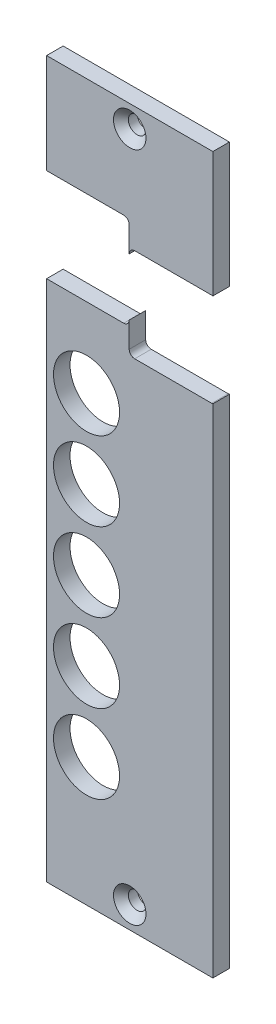
ISO-10303-21;
HEADER;
FILE_DESCRIPTION(('STEP AP214'),'2;1');
FILE_NAME('part.step','',(''),(''),'','','');
FILE_SCHEMA(('AUTOMOTIVE_DESIGN { 1 0 10303 214 1 1 1 1 }'));
ENDSEC;
DATA;
#1=APPLICATION_CONTEXT('core data for automotive mechanical design processes');
#2=APPLICATION_PROTOCOL_DEFINITION('international standard','automotive_design',2000,#1);
#3=PRODUCT_CONTEXT('',#1,'mechanical');
#4=PRODUCT('Part','Part','',(#3));
#5=PRODUCT_RELATED_PRODUCT_CATEGORY('part','',(#4));
#6=PRODUCT_DEFINITION_FORMATION('','',#4);
#7=PRODUCT_DEFINITION_CONTEXT('part definition',#1,'design');
#8=PRODUCT_DEFINITION('design','',#6,#7);
#9=PRODUCT_DEFINITION_SHAPE('','',#8);
#10=(LENGTH_UNIT() NAMED_UNIT(*) SI_UNIT(.MILLI.,.METRE.));
#11=(NAMED_UNIT(*) PLANE_ANGLE_UNIT() SI_UNIT($,.RADIAN.));
#12=(NAMED_UNIT(*) SI_UNIT($,.STERADIAN.) SOLID_ANGLE_UNIT());
#13=UNCERTAINTY_MEASURE_WITH_UNIT(LENGTH_MEASURE(1.E-05),#10,'distance_accuracy_value','');
#14=(GEOMETRIC_REPRESENTATION_CONTEXT(3) GLOBAL_UNCERTAINTY_ASSIGNED_CONTEXT((#13)) GLOBAL_UNIT_ASSIGNED_CONTEXT((#10,
#11,#12)) REPRESENTATION_CONTEXT('',''));
#15=CARTESIAN_POINT('',(0.,0.,0.));
#16=DIRECTION('',(0.,0.,1.));
#17=DIRECTION('',(1.,0.,0.));
#18=AXIS2_PLACEMENT_3D('',#15,#16,#17);
#19=CARTESIAN_POINT('',(16.,106.3,-3.));
#20=DIRECTION('',(0.,0.,1.));
#21=DIRECTION('',(1.,0.,0.));
#22=AXIS2_PLACEMENT_3D('',#19,#20,#21);
#23=CYLINDRICAL_SURFACE('',#22,0.999999999999994);
#24=CARTESIAN_POINT('',(16.,106.3,0.));
#25=DIRECTION('',(0.,0.,1.));
#26=DIRECTION('',(1.,0.,0.));
#27=AXIS2_PLACEMENT_3D('',#24,#25,#26);
#28=CIRCLE('',#27,0.999999999999994);
#29=CARTESIAN_POINT('',(16.,107.3,0.));
#30=VERTEX_POINT('',#29);
#31=CARTESIAN_POINT('',(15.,106.3,0.));
#32=VERTEX_POINT('',#31);
#33=EDGE_CURVE('E150',#30,#32,#28,.T.);
#34=ORIENTED_EDGE('',*,*,#33,.T.);
#35=DIRECTION('',(0.,0.,1.));
#36=VECTOR('',#35,1.);
#37=CARTESIAN_POINT('',(15.,106.3,-3.));
#38=LINE('',#37,#36);
#39=CARTESIAN_POINT('',(15.,106.3,-3.));
#40=VERTEX_POINT('',#39);
#41=EDGE_CURVE('E168',#40,#32,#38,.T.);
#42=ORIENTED_EDGE('',*,*,#41,.F.);
#43=CARTESIAN_POINT('',(16.,106.3,-3.));
#44=DIRECTION('',(0.,0.,1.));
#45=DIRECTION('',(1.,0.,0.));
#46=AXIS2_PLACEMENT_3D('',#43,#44,#45);
#47=CIRCLE('',#46,0.999999999999994);
#48=CARTESIAN_POINT('',(16.,107.3,-3.));
#49=VERTEX_POINT('',#48);
#50=EDGE_CURVE('E167',#49,#40,#47,.T.);
#51=ORIENTED_EDGE('',*,*,#50,.F.);
#52=DIRECTION('',(0.,0.,1.));
#53=VECTOR('',#52,1.);
#54=CARTESIAN_POINT('',(16.,107.3,-3.));
#55=LINE('',#54,#53);
#56=EDGE_CURVE('E149',#49,#30,#55,.T.);
#57=ORIENTED_EDGE('',*,*,#56,.T.);
#58=EDGE_LOOP('',(#34,#42,#51,#57));
#59=FACE_BOUND('',#58,.T.);
#60=ADVANCED_FACE('F43',(#59),#23,.F.);
#61=CARTESIAN_POINT('',(15.,0.,-3.));
#62=DIRECTION('',(1.,0.,0.));
#63=DIRECTION('',(0.,0.,-1.));
#64=AXIS2_PLACEMENT_3D('',#61,#62,#63);
#65=PLANE('',#64);
#66=DIRECTION('',(0.,1.,0.));
#67=VECTOR('',#66,1.);
#68=CARTESIAN_POINT('',(15.,0.,0.));
#69=LINE('',#68,#67);
#70=CARTESIAN_POINT('',(15.,110.9,0.));
#71=VERTEX_POINT('',#70);
#72=EDGE_CURVE('E89',#32,#71,#69,.T.);
#73=ORIENTED_EDGE('',*,*,#72,.T.);
#74=DIRECTION('',(0.,0.,1.));
#75=VECTOR('',#74,1.);
#76=CARTESIAN_POINT('',(15.,110.9,-3.));
#77=LINE('',#76,#75);
#78=CARTESIAN_POINT('',(15.,110.9,-3.));
#79=VERTEX_POINT('',#78);
#80=EDGE_CURVE('E133',#79,#71,#77,.T.);
#81=ORIENTED_EDGE('',*,*,#80,.F.);
#82=DIRECTION('',(0.,1.,0.));
#83=VECTOR('',#82,1.);
#84=CARTESIAN_POINT('',(15.,0.,-3.));
#85=LINE('',#84,#83);
#86=EDGE_CURVE('E60',#40,#79,#85,.T.);
#87=ORIENTED_EDGE('',*,*,#86,.F.);
#88=ORIENTED_EDGE('',*,*,#41,.T.);
#89=EDGE_LOOP('',(#73,#81,#87,#88));
#90=FACE_BOUND('',#89,.T.);
#91=ADVANCED_FACE('F201',(#90),#65,.F.);
#92=CARTESIAN_POINT('',(14.,110.9,-3.));
#93=DIRECTION('',(0.,0.,1.));
#94=DIRECTION('',(1.,0.,0.));
#95=AXIS2_PLACEMENT_3D('',#92,#93,#94);
#96=CYLINDRICAL_SURFACE('',#95,1.);
#97=CARTESIAN_POINT('',(14.,110.9,0.));
#98=DIRECTION('',(0.,0.,1.));
#99=DIRECTION('',(1.,0.,0.));
#100=AXIS2_PLACEMENT_3D('',#97,#98,#99);
#101=CIRCLE('',#100,1.);
#102=CARTESIAN_POINT('',(14.,111.9,0.));
#103=VERTEX_POINT('',#102);
#104=EDGE_CURVE('E130',#71,#103,#101,.T.);
#105=ORIENTED_EDGE('',*,*,#104,.T.);
#106=DIRECTION('',(0.,0.,1.));
#107=VECTOR('',#106,1.);
#108=CARTESIAN_POINT('',(14.,111.9,-3.));
#109=LINE('',#108,#107);
#110=CARTESIAN_POINT('',(14.,111.9,-3.));
#111=VERTEX_POINT('',#110);
#112=EDGE_CURVE('E128',#111,#103,#109,.T.);
#113=ORIENTED_EDGE('',*,*,#112,.F.);
#114=CARTESIAN_POINT('',(14.,110.9,-3.));
#115=DIRECTION('',(0.,0.,1.));
#116=DIRECTION('',(1.,0.,0.));
#117=AXIS2_PLACEMENT_3D('',#114,#115,#116);
#118=CIRCLE('',#117,1.);
#119=EDGE_CURVE('E118',#79,#111,#118,.T.);
#120=ORIENTED_EDGE('',*,*,#119,.F.);
#121=ORIENTED_EDGE('',*,*,#80,.T.);
#122=EDGE_LOOP('',(#105,#113,#120,#121));
#123=FACE_BOUND('',#122,.T.);
#124=ADVANCED_FACE('F129',(#123),#96,.F.);
#125=CARTESIAN_POINT('',(0.,111.9,-3.));
#126=DIRECTION('',(0.,1.,0.));
#127=DIRECTION('',(0.,0.,1.));
#128=AXIS2_PLACEMENT_3D('',#125,#126,#127);
#129=PLANE('',#128);
#130=DIRECTION('',(-1.,0.,0.));
#131=VECTOR('',#130,1.);
#132=CARTESIAN_POINT('',(0.,111.9,0.));
#133=LINE('',#132,#131);
#134=CARTESIAN_POINT('',(0.,111.9,0.));
#135=VERTEX_POINT('',#134);
#136=EDGE_CURVE('E163',#103,#135,#133,.T.);
#137=ORIENTED_EDGE('',*,*,#136,.T.);
#138=DIRECTION('',(0.,0.,1.));
#139=VECTOR('',#138,1.);
#140=CARTESIAN_POINT('',(0.,111.9,-3.));
#141=LINE('',#140,#139);
#142=CARTESIAN_POINT('',(0.,111.9,-3.));
#143=VERTEX_POINT('',#142);
#144=EDGE_CURVE('E134',#143,#135,#141,.T.);
#145=ORIENTED_EDGE('',*,*,#144,.F.);
#146=DIRECTION('',(-1.,0.,0.));
#147=VECTOR('',#146,1.);
#148=CARTESIAN_POINT('',(0.,111.9,-3.));
#149=LINE('',#148,#147);
#150=EDGE_CURVE('E123',#111,#143,#149,.T.);
#151=ORIENTED_EDGE('',*,*,#150,.F.);
#152=ORIENTED_EDGE('',*,*,#112,.T.);
#153=EDGE_LOOP('',(#137,#145,#151,#152));
#154=FACE_BOUND('',#153,.T.);
#155=ADVANCED_FACE('F136',(#154),#129,.F.);
#156=CARTESIAN_POINT('',(0.,0.,-3.));
#157=DIRECTION('',(1.,0.,0.));
#158=DIRECTION('',(0.,0.,-1.));
#159=AXIS2_PLACEMENT_3D('',#156,#157,#158);
#160=PLANE('',#159);
#161=DIRECTION('',(0.,1.,0.));
#162=VECTOR('',#161,1.);
#163=CARTESIAN_POINT('',(0.,0.,0.));
#164=LINE('',#163,#162);
#165=CARTESIAN_POINT('',(0.,130.,0.));
#166=VERTEX_POINT('',#165);
#167=EDGE_CURVE('E161',#135,#166,#164,.T.);
#168=ORIENTED_EDGE('',*,*,#167,.T.);
#169=DIRECTION('',(0.,0.,1.));
#170=VECTOR('',#169,1.);
#171=CARTESIAN_POINT('',(0.,130.,-3.));
#172=LINE('',#171,#170);
#173=CARTESIAN_POINT('',(0.,130.,-3.));
#174=VERTEX_POINT('',#173);
#175=EDGE_CURVE('E172',#174,#166,#172,.T.);
#176=ORIENTED_EDGE('',*,*,#175,.F.);
#177=DIRECTION('',(0.,1.,0.));
#178=VECTOR('',#177,1.);
#179=CARTESIAN_POINT('',(0.,0.,-3.));
#180=LINE('',#179,#178);
#181=EDGE_CURVE('E139',#143,#174,#180,.T.);
#182=ORIENTED_EDGE('',*,*,#181,.F.);
#183=ORIENTED_EDGE('',*,*,#144,.T.);
#184=EDGE_LOOP('',(#168,#176,#182,#183));
#185=FACE_BOUND('',#184,.T.);
#186=ADVANCED_FACE('F223',(#185),#160,.F.);
#187=CARTESIAN_POINT('',(0.,130.,-3.));
#188=DIRECTION('',(0.,-1.,0.));
#189=DIRECTION('',(0.,0.,-1.));
#190=AXIS2_PLACEMENT_3D('',#187,#188,#189);
#191=PLANE('',#190);
#192=DIRECTION('',(1.,0.,0.));
#193=VECTOR('',#192,1.);
#194=CARTESIAN_POINT('',(0.,130.,0.));
#195=LINE('',#194,#193);
#196=CARTESIAN_POINT('',(30.2,130.,0.));
#197=VERTEX_POINT('',#196);
#198=EDGE_CURVE('E159',#166,#197,#195,.T.);
#199=ORIENTED_EDGE('',*,*,#198,.T.);
#200=DIRECTION('',(0.,0.,1.));
#201=VECTOR('',#200,1.);
#202=CARTESIAN_POINT('',(30.2,130.,-3.));
#203=LINE('',#202,#201);
#204=CARTESIAN_POINT('',(30.2,130.,-3.));
#205=VERTEX_POINT('',#204);
#206=EDGE_CURVE('E175',#205,#197,#203,.T.);
#207=ORIENTED_EDGE('',*,*,#206,.F.);
#208=DIRECTION('',(1.,0.,0.));
#209=VECTOR('',#208,1.);
#210=CARTESIAN_POINT('',(0.,130.,-3.));
#211=LINE('',#210,#209);
#212=EDGE_CURVE('E141',#174,#205,#211,.T.);
#213=ORIENTED_EDGE('',*,*,#212,.F.);
#214=ORIENTED_EDGE('',*,*,#175,.T.);
#215=EDGE_LOOP('',(#199,#207,#213,#214));
#216=FACE_BOUND('',#215,.T.);
#217=ADVANCED_FACE('F219',(#216),#191,.F.);
#218=CARTESIAN_POINT('',(30.2,0.,-3.));
#219=DIRECTION('',(-1.,0.,0.));
#220=DIRECTION('',(0.,0.,1.));
#221=AXIS2_PLACEMENT_3D('',#218,#219,#220);
#222=PLANE('',#221);
#223=DIRECTION('',(0.,-1.,0.));
#224=VECTOR('',#223,1.);
#225=CARTESIAN_POINT('',(30.2,0.,0.));
#226=LINE('',#225,#224);
#227=CARTESIAN_POINT('',(30.2,107.279795897113,0.));
#228=VERTEX_POINT('',#227);
#229=EDGE_CURVE('E157',#197,#228,#226,.T.);
#230=ORIENTED_EDGE('',*,*,#229,.T.);
#231=DIRECTION('',(0.,0.,1.));
#232=VECTOR('',#231,1.);
#233=CARTESIAN_POINT('',(30.2,107.279795897113,-3.));
#234=LINE('',#233,#232);
#235=CARTESIAN_POINT('',(30.2,107.279795897113,-3.));
#236=VERTEX_POINT('',#235);
#237=EDGE_CURVE('E178',#236,#228,#234,.T.);
#238=ORIENTED_EDGE('',*,*,#237,.F.);
#239=DIRECTION('',(0.,-1.,0.));
#240=VECTOR('',#239,1.);
#241=CARTESIAN_POINT('',(30.2,0.,-3.));
#242=LINE('',#241,#240);
#243=EDGE_CURVE('E343',#205,#236,#242,.T.);
#244=ORIENTED_EDGE('',*,*,#243,.F.);
#245=ORIENTED_EDGE('',*,*,#206,.T.);
#246=EDGE_LOOP('',(#230,#238,#244,#245));
#247=FACE_BOUND('',#246,.T.);
#248=ADVANCED_FACE('F215',(#247),#222,.F.);
#249=CARTESIAN_POINT('',(30.,106.3,-3.));
#250=DIRECTION('',(0.,0.,1.));
#251=DIRECTION('',(1.,0.,0.));
#252=AXIS2_PLACEMENT_3D('',#249,#250,#251);
#253=CYLINDRICAL_SURFACE('',#252,0.999999999999994);
#254=CARTESIAN_POINT('',(30.,106.3,0.));
#255=DIRECTION('',(0.,0.,1.));
#256=DIRECTION('',(1.,0.,0.));
#257=AXIS2_PLACEMENT_3D('',#254,#255,#256);
#258=CIRCLE('',#257,0.999999999999994);
#259=CARTESIAN_POINT('',(30.,107.3,0.));
#260=VERTEX_POINT('',#259);
#261=EDGE_CURVE('E155',#228,#260,#258,.T.);
#262=ORIENTED_EDGE('',*,*,#261,.T.);
#263=DIRECTION('',(0.,0.,1.));
#264=VECTOR('',#263,1.);
#265=CARTESIAN_POINT('',(30.,107.3,-3.));
#266=LINE('',#265,#264);
#267=CARTESIAN_POINT('',(30.,107.3,-3.));
#268=VERTEX_POINT('',#267);
#269=EDGE_CURVE('E181',#268,#260,#266,.T.);
#270=ORIENTED_EDGE('',*,*,#269,.F.);
#271=CARTESIAN_POINT('',(30.,106.3,-3.));
#272=DIRECTION('',(0.,0.,1.));
#273=DIRECTION('',(1.,0.,0.));
#274=AXIS2_PLACEMENT_3D('',#271,#272,#273);
#275=CIRCLE('',#274,0.999999999999994);
#276=EDGE_CURVE('E342',#236,#268,#275,.T.);
#277=ORIENTED_EDGE('',*,*,#276,.F.);
#278=ORIENTED_EDGE('',*,*,#237,.T.);
#279=EDGE_LOOP('',(#262,#270,#277,#278));
#280=FACE_BOUND('',#279,.T.);
#281=ADVANCED_FACE('F211',(#280),#253,.F.);
#282=CARTESIAN_POINT('',(0.,107.3,-3.));
#283=DIRECTION('',(0.,1.,0.));
#284=DIRECTION('',(0.,0.,1.));
#285=AXIS2_PLACEMENT_3D('',#282,#283,#284);
#286=PLANE('',#285);
#287=DIRECTION('',(-1.,0.,0.));
#288=VECTOR('',#287,1.);
#289=CARTESIAN_POINT('',(0.,107.3,0.));
#290=LINE('',#289,#288);
#291=EDGE_CURVE('E153',#260,#30,#290,.T.);
#292=ORIENTED_EDGE('',*,*,#291,.T.);
#293=ORIENTED_EDGE('',*,*,#56,.F.);
#294=DIRECTION('',(-1.,0.,0.));
#295=VECTOR('',#294,1.);
#296=CARTESIAN_POINT('',(0.,107.3,-3.));
#297=LINE('',#296,#295);
#298=EDGE_CURVE('E101',#268,#49,#297,.T.);
#299=ORIENTED_EDGE('',*,*,#298,.F.);
#300=ORIENTED_EDGE('',*,*,#269,.T.);
#301=EDGE_LOOP('',(#292,#293,#299,#300));
#302=FACE_BOUND('',#301,.T.);
#303=ADVANCED_FACE('F208',(#302),#286,.F.);
#304=CARTESIAN_POINT('',(15.1,126.,-3.));
#305=DIRECTION('',(0.,0.,1.));
#306=DIRECTION('',(1.,0.,0.));
#307=AXIS2_PLACEMENT_3D('',#304,#305,#306);
#308=CYLINDRICAL_SURFACE('',#307,1.6);
#309=CARTESIAN_POINT('',(15.1,126.,-1.35));
#310=DIRECTION('',(0.,0.,1.));
#311=DIRECTION('',(1.,0.,0.));
#312=AXIS2_PLACEMENT_3D('',#309,#310,#311);
#313=CIRCLE('',#312,1.6);
#314=CARTESIAN_POINT('',(16.7,126.,-1.35));
#315=VERTEX_POINT('',#314);
#316=EDGE_CURVE('E52',#315,#315,#313,.T.);
#317=ORIENTED_EDGE('',*,*,#316,.T.);
#318=EDGE_LOOP('',(#317));
#319=FACE_BOUND('',#318,.T.);
#320=CARTESIAN_POINT('',(15.1,126.,-3.));
#321=DIRECTION('',(0.,0.,1.));
#322=DIRECTION('',(1.,0.,0.));
#323=AXIS2_PLACEMENT_3D('',#320,#321,#322);
#324=CIRCLE('',#323,1.6);
#325=CARTESIAN_POINT('',(16.7,126.,-3.));
#326=VERTEX_POINT('',#325);
#327=EDGE_CURVE('E146',#326,#326,#324,.T.);
#328=ORIENTED_EDGE('',*,*,#327,.F.);
#329=EDGE_LOOP('',(#328));
#330=FACE_BOUND('',#329,.T.);
#331=ADVANCED_FACE('F188',(#319,#330),#308,.F.);
#332=CARTESIAN_POINT('',(0.,0.,-3.));
#333=DIRECTION('',(0.,0.,1.));
#334=DIRECTION('',(1.,0.,0.));
#335=AXIS2_PLACEMENT_3D('',#332,#333,#334);
#336=PLANE('',#335);
#337=ORIENTED_EDGE('',*,*,#50,.T.);
#338=ORIENTED_EDGE('',*,*,#86,.T.);
#339=ORIENTED_EDGE('',*,*,#119,.T.);
#340=ORIENTED_EDGE('',*,*,#150,.T.);
#341=ORIENTED_EDGE('',*,*,#181,.T.);
#342=ORIENTED_EDGE('',*,*,#212,.T.);
#343=ORIENTED_EDGE('',*,*,#243,.T.);
#344=ORIENTED_EDGE('',*,*,#276,.T.);
#345=ORIENTED_EDGE('',*,*,#298,.T.);
#346=EDGE_LOOP('',(#337,#338,#339,#340,#341,#342,#343,#344,#345));
#347=FACE_BOUND('',#346,.T.);
#348=ORIENTED_EDGE('',*,*,#327,.T.);
#349=EDGE_LOOP('',(#348));
#350=FACE_BOUND('',#349,.T.);
#351=ADVANCED_FACE('F120',(#347,#350),#336,.F.);
#352=CARTESIAN_POINT('',(0.,0.,0.));
#353=DIRECTION('',(0.,0.,1.));
#354=DIRECTION('',(1.,0.,0.));
#355=AXIS2_PLACEMENT_3D('',#352,#353,#354);
#356=PLANE('',#355);
#357=CARTESIAN_POINT('',(15.1,126.,0.));
#358=DIRECTION('',(0.,0.,1.));
#359=DIRECTION('',(1.,0.,0.));
#360=AXIS2_PLACEMENT_3D('',#357,#358,#359);
#361=CIRCLE('',#360,2.95000000000001);
#362=CARTESIAN_POINT('',(18.05,126.,0.));
#363=VERTEX_POINT('',#362);
#364=EDGE_CURVE('E12',#363,#363,#361,.F.);
#365=ORIENTED_EDGE('',*,*,#364,.T.);
#366=EDGE_LOOP('',(#365));
#367=FACE_BOUND('',#366,.T.);
#368=ORIENTED_EDGE('',*,*,#33,.F.);
#369=ORIENTED_EDGE('',*,*,#291,.F.);
#370=ORIENTED_EDGE('',*,*,#261,.F.);
#371=ORIENTED_EDGE('',*,*,#229,.F.);
#372=ORIENTED_EDGE('',*,*,#198,.F.);
#373=ORIENTED_EDGE('',*,*,#167,.F.);
#374=ORIENTED_EDGE('',*,*,#136,.F.);
#375=ORIENTED_EDGE('',*,*,#104,.F.);
#376=ORIENTED_EDGE('',*,*,#72,.F.);
#377=EDGE_LOOP('',(#368,#369,#370,#371,#372,#373,#374,#375,#376));
#378=FACE_BOUND('',#377,.T.);
#379=ADVANCED_FACE('F192',(#367,#378),#356,.T.);
#380=CARTESIAN_POINT('',(15.1,126.,-1.35));
#381=DIRECTION('',(0.,0.,1.));
#382=DIRECTION('',(1.,0.,0.));
#383=AXIS2_PLACEMENT_3D('',#380,#381,#382);
#384=CONICAL_SURFACE('',#383,1.6,0.78539816339745);
#385=ORIENTED_EDGE('',*,*,#364,.F.);
#386=EDGE_LOOP('',(#385));
#387=FACE_BOUND('',#386,.T.);
#388=ORIENTED_EDGE('',*,*,#316,.F.);
#389=EDGE_LOOP('',(#388));
#390=FACE_BOUND('',#389,.T.);
#391=ADVANCED_FACE('F45',(#387,#390),#384,.F.);
#392=CLOSED_SHELL('',(#60,#91,#124,#155,#186,#217,#248,#281,#303,#331,#351,#379,#391));
#393=MANIFOLD_SOLID_BREP('B2',#392);
#394=CARTESIAN_POINT('',(30.,91.3,-3.));
#395=DIRECTION('',(0.,0.,1.));
#396=DIRECTION('',(1.,0.,0.));
#397=AXIS2_PLACEMENT_3D('',#394,#395,#396);
#398=CYLINDRICAL_SURFACE('',#397,0.999999999999994);
#399=CARTESIAN_POINT('',(30.,91.3,0.));
#400=DIRECTION('',(0.,0.,1.));
#401=DIRECTION('',(1.,0.,0.));
#402=AXIS2_PLACEMENT_3D('',#399,#400,#401);
#403=CIRCLE('',#402,0.999999999999994);
#404=CARTESIAN_POINT('',(30.,90.3,0.));
#405=VERTEX_POINT('',#404);
#406=CARTESIAN_POINT('',(30.2,90.3202041028867,0.));
#407=VERTEX_POINT('',#406);
#408=EDGE_CURVE('E476',#405,#407,#403,.T.);
#409=ORIENTED_EDGE('',*,*,#408,.T.);
#410=DIRECTION('',(0.,0.,1.));
#411=VECTOR('',#410,1.);
#412=CARTESIAN_POINT('',(30.2,90.3202041028867,-3.));
#413=LINE('',#412,#411);
#414=CARTESIAN_POINT('',(30.2,90.3202041028867,-3.));
#415=VERTEX_POINT('',#414);
#416=EDGE_CURVE('E494',#415,#407,#413,.T.);
#417=ORIENTED_EDGE('',*,*,#416,.F.);
#418=CARTESIAN_POINT('',(30.,91.3,-3.));
#419=DIRECTION('',(0.,0.,1.));
#420=DIRECTION('',(1.,0.,0.));
#421=AXIS2_PLACEMENT_3D('',#418,#419,#420);
#422=CIRCLE('',#421,0.999999999999994);
#423=CARTESIAN_POINT('',(30.,90.3,-3.));
#424=VERTEX_POINT('',#423);
#425=EDGE_CURVE('E577',#424,#415,#422,.T.);
#426=ORIENTED_EDGE('',*,*,#425,.F.);
#427=DIRECTION('',(0.,0.,1.));
#428=VECTOR('',#427,1.);
#429=CARTESIAN_POINT('',(30.,90.3,-3.));
#430=LINE('',#429,#428);
#431=EDGE_CURVE('E460',#424,#405,#430,.T.);
#432=ORIENTED_EDGE('',*,*,#431,.T.);
#433=EDGE_LOOP('',(#409,#417,#426,#432));
#434=FACE_BOUND('',#433,.T.);
#435=ADVANCED_FACE('F354',(#434),#398,.F.);
#436=CARTESIAN_POINT('',(30.2,0.,-3.));
#437=DIRECTION('',(-1.,0.,0.));
#438=DIRECTION('',(0.,0.,1.));
#439=AXIS2_PLACEMENT_3D('',#436,#437,#438);
#440=PLANE('',#439);
#441=DIRECTION('',(0.,-1.,0.));
#442=VECTOR('',#441,1.);
#443=CARTESIAN_POINT('',(30.2,0.,0.));
#444=LINE('',#443,#442);
#445=CARTESIAN_POINT('',(30.2,0.,0.));
#446=VERTEX_POINT('',#445);
#447=EDGE_CURVE('E400',#407,#446,#444,.T.);
#448=ORIENTED_EDGE('',*,*,#447,.T.);
#449=DIRECTION('',(0.,0.,1.));
#450=VECTOR('',#449,1.);
#451=CARTESIAN_POINT('',(30.2,0.,-3.));
#452=LINE('',#451,#450);
#453=CARTESIAN_POINT('',(30.2,0.,-3.));
#454=VERTEX_POINT('',#453);
#455=EDGE_CURVE('E444',#454,#446,#452,.T.);
#456=ORIENTED_EDGE('',*,*,#455,.F.);
#457=DIRECTION('',(0.,-1.,0.));
#458=VECTOR('',#457,1.);
#459=CARTESIAN_POINT('',(30.2,0.,-3.));
#460=LINE('',#459,#458);
#461=EDGE_CURVE('E371',#415,#454,#460,.T.);
#462=ORIENTED_EDGE('',*,*,#461,.F.);
#463=ORIENTED_EDGE('',*,*,#416,.T.);
#464=EDGE_LOOP('',(#448,#456,#462,#463));
#465=FACE_BOUND('',#464,.T.);
#466=ADVANCED_FACE('F527',(#465),#440,.F.);
#467=CARTESIAN_POINT('',(0.,0.,-3.));
#468=DIRECTION('',(0.,1.,0.));
#469=DIRECTION('',(0.,0.,1.));
#470=AXIS2_PLACEMENT_3D('',#467,#468,#469);
#471=PLANE('',#470);
#472=DIRECTION('',(-1.,0.,0.));
#473=VECTOR('',#472,1.);
#474=CARTESIAN_POINT('',(0.,0.,0.));
#475=LINE('',#474,#473);
#476=CARTESIAN_POINT('',(0.,0.,0.));
#477=VERTEX_POINT('',#476);
#478=EDGE_CURVE('E441',#446,#477,#475,.T.);
#479=ORIENTED_EDGE('',*,*,#478,.T.);
#480=DIRECTION('',(0.,0.,1.));
#481=VECTOR('',#480,1.);
#482=CARTESIAN_POINT('',(0.,0.,-3.));
#483=LINE('',#482,#481);
#484=CARTESIAN_POINT('',(0.,0.,-3.));
#485=VERTEX_POINT('',#484);
#486=EDGE_CURVE('E439',#485,#477,#483,.T.);
#487=ORIENTED_EDGE('',*,*,#486,.F.);
#488=DIRECTION('',(-1.,0.,0.));
#489=VECTOR('',#488,1.);
#490=CARTESIAN_POINT('',(0.,0.,-3.));
#491=LINE('',#490,#489);
#492=EDGE_CURVE('E429',#454,#485,#491,.T.);
#493=ORIENTED_EDGE('',*,*,#492,.F.);
#494=ORIENTED_EDGE('',*,*,#455,.T.);
#495=EDGE_LOOP('',(#479,#487,#493,#494));
#496=FACE_BOUND('',#495,.T.);
#497=ADVANCED_FACE('F440',(#496),#471,.F.);
#498=CARTESIAN_POINT('',(0.,0.,-3.));
#499=DIRECTION('',(1.,0.,0.));
#500=DIRECTION('',(0.,0.,-1.));
#501=AXIS2_PLACEMENT_3D('',#498,#499,#500);
#502=PLANE('',#501);
#503=DIRECTION('',(0.,1.,0.));
#504=VECTOR('',#503,1.);
#505=CARTESIAN_POINT('',(0.,0.,0.));
#506=LINE('',#505,#504);
#507=CARTESIAN_POINT('',(0.,94.9,0.));
#508=VERTEX_POINT('',#507);
#509=EDGE_CURVE('E489',#477,#508,#506,.T.);
#510=ORIENTED_EDGE('',*,*,#509,.T.);
#511=DIRECTION('',(0.,0.,1.));
#512=VECTOR('',#511,1.);
#513=CARTESIAN_POINT('',(0.,94.9,-3.));
#514=LINE('',#513,#512);
#515=CARTESIAN_POINT('',(0.,94.9,-3.));
#516=VERTEX_POINT('',#515);
#517=EDGE_CURVE('E445',#516,#508,#514,.T.);
#518=ORIENTED_EDGE('',*,*,#517,.F.);
#519=DIRECTION('',(0.,1.,0.));
#520=VECTOR('',#519,1.);
#521=CARTESIAN_POINT('',(0.,0.,-3.));
#522=LINE('',#521,#520);
#523=EDGE_CURVE('E434',#485,#516,#522,.T.);
#524=ORIENTED_EDGE('',*,*,#523,.F.);
#525=ORIENTED_EDGE('',*,*,#486,.T.);
#526=EDGE_LOOP('',(#510,#518,#524,#525));
#527=FACE_BOUND('',#526,.T.);
#528=ADVANCED_FACE('F447',(#527),#502,.F.);
#529=CARTESIAN_POINT('',(0.,94.9,-3.));
#530=DIRECTION('',(0.,-1.,0.));
#531=DIRECTION('',(0.,0.,-1.));
#532=AXIS2_PLACEMENT_3D('',#529,#530,#531);
#533=PLANE('',#532);
#534=DIRECTION('',(1.,0.,0.));
#535=VECTOR('',#534,1.);
#536=CARTESIAN_POINT('',(0.,94.9,0.));
#537=LINE('',#536,#535);
#538=CARTESIAN_POINT('',(14.,94.9,0.));
#539=VERTEX_POINT('',#538);
#540=EDGE_CURVE('E487',#508,#539,#537,.T.);
#541=ORIENTED_EDGE('',*,*,#540,.T.);
#542=DIRECTION('',(0.,0.,1.));
#543=VECTOR('',#542,1.);
#544=CARTESIAN_POINT('',(14.,94.9,-3.));
#545=LINE('',#544,#543);
#546=CARTESIAN_POINT('',(14.,94.9,-3.));
#547=VERTEX_POINT('',#546);
#548=EDGE_CURVE('E498',#547,#539,#545,.T.);
#549=ORIENTED_EDGE('',*,*,#548,.F.);
#550=DIRECTION('',(1.,0.,0.));
#551=VECTOR('',#550,1.);
#552=CARTESIAN_POINT('',(0.,94.9,-3.));
#553=LINE('',#552,#551);
#554=EDGE_CURVE('E450',#516,#547,#553,.T.);
#555=ORIENTED_EDGE('',*,*,#554,.F.);
#556=ORIENTED_EDGE('',*,*,#517,.T.);
#557=EDGE_LOOP('',(#541,#549,#555,#556));
#558=FACE_BOUND('',#557,.T.);
#559=ADVANCED_FACE('F598',(#558),#533,.F.);
#560=CARTESIAN_POINT('',(14.,95.9,-3.));
#561=DIRECTION('',(0.,0.,1.));
#562=DIRECTION('',(1.,0.,0.));
#563=AXIS2_PLACEMENT_3D('',#560,#561,#562);
#564=CYLINDRICAL_SURFACE('',#563,1.);
#565=CARTESIAN_POINT('',(14.,95.9,0.));
#566=DIRECTION('',(0.,0.,1.));
#567=DIRECTION('',(1.,0.,0.));
#568=AXIS2_PLACEMENT_3D('',#565,#566,#567);
#569=CIRCLE('',#568,1.);
#570=CARTESIAN_POINT('',(15.,95.9,0.));
#571=VERTEX_POINT('',#570);
#572=EDGE_CURVE('E485',#539,#571,#569,.T.);
#573=ORIENTED_EDGE('',*,*,#572,.T.);
#574=DIRECTION('',(0.,0.,1.));
#575=VECTOR('',#574,1.);
#576=CARTESIAN_POINT('',(15.,95.9,-3.));
#577=LINE('',#576,#575);
#578=CARTESIAN_POINT('',(15.,95.9,-3.));
#579=VERTEX_POINT('',#578);
#580=EDGE_CURVE('E501',#579,#571,#577,.T.);
#581=ORIENTED_EDGE('',*,*,#580,.F.);
#582=CARTESIAN_POINT('',(14.,95.9,-3.));
#583=DIRECTION('',(0.,0.,1.));
#584=DIRECTION('',(1.,0.,0.));
#585=AXIS2_PLACEMENT_3D('',#582,#583,#584);
#586=CIRCLE('',#585,1.);
#587=EDGE_CURVE('E452',#547,#579,#586,.T.);
#588=ORIENTED_EDGE('',*,*,#587,.F.);
#589=ORIENTED_EDGE('',*,*,#548,.T.);
#590=EDGE_LOOP('',(#573,#581,#588,#589));
#591=FACE_BOUND('',#590,.T.);
#592=ADVANCED_FACE('F595',(#591),#564,.F.);
#593=CARTESIAN_POINT('',(15.,0.,-3.));
#594=DIRECTION('',(-1.,0.,0.));
#595=DIRECTION('',(0.,0.,1.));
#596=AXIS2_PLACEMENT_3D('',#593,#594,#595);
#597=PLANE('',#596);
#598=DIRECTION('',(0.,-1.,0.));
#599=VECTOR('',#598,1.);
#600=CARTESIAN_POINT('',(15.,0.,0.));
#601=LINE('',#600,#599);
#602=CARTESIAN_POINT('',(15.,91.3,0.));
#603=VERTEX_POINT('',#602);
#604=EDGE_CURVE('E483',#571,#603,#601,.T.);
#605=ORIENTED_EDGE('',*,*,#604,.T.);
#606=DIRECTION('',(0.,0.,1.));
#607=VECTOR('',#606,1.);
#608=CARTESIAN_POINT('',(15.,91.3,-3.));
#609=LINE('',#608,#607);
#610=CARTESIAN_POINT('',(15.,91.3,-3.));
#611=VERTEX_POINT('',#610);
#612=EDGE_CURVE('E504',#611,#603,#609,.T.);
#613=ORIENTED_EDGE('',*,*,#612,.F.);
#614=DIRECTION('',(0.,-1.,0.));
#615=VECTOR('',#614,1.);
#616=CARTESIAN_POINT('',(15.,0.,-3.));
#617=LINE('',#616,#615);
#618=EDGE_CURVE('E592',#579,#611,#617,.T.);
#619=ORIENTED_EDGE('',*,*,#618,.F.);
#620=ORIENTED_EDGE('',*,*,#580,.T.);
#621=EDGE_LOOP('',(#605,#613,#619,#620));
#622=FACE_BOUND('',#621,.T.);
#623=ADVANCED_FACE('F589',(#622),#597,.F.);
#624=CARTESIAN_POINT('',(16.,91.3,-3.));
#625=DIRECTION('',(0.,0.,1.));
#626=DIRECTION('',(1.,0.,0.));
#627=AXIS2_PLACEMENT_3D('',#624,#625,#626);
#628=CYLINDRICAL_SURFACE('',#627,0.999999999999994);
#629=CARTESIAN_POINT('',(16.,91.3,0.));
#630=DIRECTION('',(0.,0.,1.));
#631=DIRECTION('',(1.,0.,0.));
#632=AXIS2_PLACEMENT_3D('',#629,#630,#631);
#633=CIRCLE('',#632,0.999999999999994);
#634=CARTESIAN_POINT('',(16.,90.3,0.));
#635=VERTEX_POINT('',#634);
#636=EDGE_CURVE('E481',#603,#635,#633,.T.);
#637=ORIENTED_EDGE('',*,*,#636,.T.);
#638=DIRECTION('',(0.,0.,1.));
#639=VECTOR('',#638,1.);
#640=CARTESIAN_POINT('',(16.,90.3,-3.));
#641=LINE('',#640,#639);
#642=CARTESIAN_POINT('',(16.,90.3,-3.));
#643=VERTEX_POINT('',#642);
#644=EDGE_CURVE('E507',#643,#635,#641,.T.);
#645=ORIENTED_EDGE('',*,*,#644,.F.);
#646=CARTESIAN_POINT('',(16.,91.3,-3.));
#647=DIRECTION('',(0.,0.,1.));
#648=DIRECTION('',(1.,0.,0.));
#649=AXIS2_PLACEMENT_3D('',#646,#647,#648);
#650=CIRCLE('',#649,0.999999999999994);
#651=EDGE_CURVE('E583',#611,#643,#650,.T.);
#652=ORIENTED_EDGE('',*,*,#651,.F.);
#653=ORIENTED_EDGE('',*,*,#612,.T.);
#654=EDGE_LOOP('',(#637,#645,#652,#653));
#655=FACE_BOUND('',#654,.T.);
#656=ADVANCED_FACE('F582',(#655),#628,.F.);
#657=CARTESIAN_POINT('',(0.,90.3,-3.));
#658=DIRECTION('',(0.,-1.,0.));
#659=DIRECTION('',(0.,0.,-1.));
#660=AXIS2_PLACEMENT_3D('',#657,#658,#659);
#661=PLANE('',#660);
#662=DIRECTION('',(1.,0.,0.));
#663=VECTOR('',#662,1.);
#664=CARTESIAN_POINT('',(0.,90.3,0.));
#665=LINE('',#664,#663);
#666=EDGE_CURVE('E479',#635,#405,#665,.T.);
#667=ORIENTED_EDGE('',*,*,#666,.T.);
#668=ORIENTED_EDGE('',*,*,#431,.F.);
#669=DIRECTION('',(1.,0.,0.));
#670=VECTOR('',#669,1.);
#671=CARTESIAN_POINT('',(0.,90.3,-3.));
#672=LINE('',#671,#670);
#673=EDGE_CURVE('E412',#643,#424,#672,.T.);
#674=ORIENTED_EDGE('',*,*,#673,.F.);
#675=ORIENTED_EDGE('',*,*,#644,.T.);
#676=EDGE_LOOP('',(#667,#668,#674,#675));
#677=FACE_BOUND('',#676,.T.);
#678=ADVANCED_FACE('F536',(#677),#661,.F.);
#679=CARTESIAN_POINT('',(7.25,23.29,-3.));
#680=DIRECTION('',(0.,0.,1.));
#681=DIRECTION('',(1.,0.,0.));
#682=AXIS2_PLACEMENT_3D('',#679,#680,#681);
#683=CYLINDRICAL_SURFACE('',#682,6.);
#684=CARTESIAN_POINT('',(7.25,23.29,-3.));
#685=DIRECTION('',(0.,0.,1.));
#686=DIRECTION('',(1.,0.,0.));
#687=AXIS2_PLACEMENT_3D('',#684,#685,#686);
#688=CIRCLE('',#687,6.);
#689=CARTESIAN_POINT('',(13.25,23.29,-3.));
#690=VERTEX_POINT('',#689);
#691=EDGE_CURVE('E604',#690,#690,#688,.T.);
#692=ORIENTED_EDGE('',*,*,#691,.F.);
#693=EDGE_LOOP('',(#692));
#694=FACE_BOUND('',#693,.T.);
#695=CARTESIAN_POINT('',(7.25,23.29,0.));
#696=DIRECTION('',(0.,0.,1.));
#697=DIRECTION('',(1.,0.,0.));
#698=AXIS2_PLACEMENT_3D('',#695,#696,#697);
#699=CIRCLE('',#698,6.);
#700=CARTESIAN_POINT('',(13.25,23.29,0.));
#701=VERTEX_POINT('',#700);
#702=EDGE_CURVE('E473',#701,#701,#699,.T.);
#703=ORIENTED_EDGE('',*,*,#702,.T.);
#704=EDGE_LOOP('',(#703));
#705=FACE_BOUND('',#704,.T.);
#706=ADVANCED_FACE('F538',(#694,#705),#683,.F.);
#707=CARTESIAN_POINT('',(7.25,37.59,-3.));
#708=DIRECTION('',(0.,0.,1.));
#709=DIRECTION('',(1.,0.,0.));
#710=AXIS2_PLACEMENT_3D('',#707,#708,#709);
#711=CYLINDRICAL_SURFACE('',#710,6.);
#712=CARTESIAN_POINT('',(7.25,37.59,-3.));
#713=DIRECTION('',(0.,0.,1.));
#714=DIRECTION('',(1.,0.,0.));
#715=AXIS2_PLACEMENT_3D('',#712,#713,#714);
#716=CIRCLE('',#715,6.);
#717=CARTESIAN_POINT('',(13.25,37.59,-3.));
#718=VERTEX_POINT('',#717);
#719=EDGE_CURVE('E607',#718,#718,#716,.T.);
#720=ORIENTED_EDGE('',*,*,#719,.F.);
#721=EDGE_LOOP('',(#720));
#722=FACE_BOUND('',#721,.T.);
#723=CARTESIAN_POINT('',(7.25,37.59,0.));
#724=DIRECTION('',(0.,0.,1.));
#725=DIRECTION('',(1.,0.,0.));
#726=AXIS2_PLACEMENT_3D('',#723,#724,#725);
#727=CIRCLE('',#726,6.);
#728=CARTESIAN_POINT('',(13.25,37.59,0.));
#729=VERTEX_POINT('',#728);
#730=EDGE_CURVE('E470',#729,#729,#727,.T.);
#731=ORIENTED_EDGE('',*,*,#730,.T.);
#732=EDGE_LOOP('',(#731));
#733=FACE_BOUND('',#732,.T.);
#734=ADVANCED_FACE('F541',(#722,#733),#711,.F.);
#735=CARTESIAN_POINT('',(7.25,51.89,-3.));
#736=DIRECTION('',(0.,0.,1.));
#737=DIRECTION('',(1.,0.,0.));
#738=AXIS2_PLACEMENT_3D('',#735,#736,#737);
#739=CYLINDRICAL_SURFACE('',#738,6.);
#740=CARTESIAN_POINT('',(7.25,51.89,-3.));
#741=DIRECTION('',(0.,0.,1.));
#742=DIRECTION('',(1.,0.,0.));
#743=AXIS2_PLACEMENT_3D('',#740,#741,#742);
#744=CIRCLE('',#743,6.);
#745=CARTESIAN_POINT('',(13.25,51.89,-3.));
#746=VERTEX_POINT('',#745);
#747=EDGE_CURVE('E610',#746,#746,#744,.T.);
#748=ORIENTED_EDGE('',*,*,#747,.F.);
#749=EDGE_LOOP('',(#748));
#750=FACE_BOUND('',#749,.T.);
#751=CARTESIAN_POINT('',(7.25,51.89,0.));
#752=DIRECTION('',(0.,0.,1.));
#753=DIRECTION('',(1.,0.,0.));
#754=AXIS2_PLACEMENT_3D('',#751,#752,#753);
#755=CIRCLE('',#754,6.);
#756=CARTESIAN_POINT('',(13.25,51.89,0.));
#757=VERTEX_POINT('',#756);
#758=EDGE_CURVE('E467',#757,#757,#755,.T.);
#759=ORIENTED_EDGE('',*,*,#758,.T.);
#760=EDGE_LOOP('',(#759));
#761=FACE_BOUND('',#760,.T.);
#762=ADVANCED_FACE('F545',(#750,#761),#739,.F.);
#763=CARTESIAN_POINT('',(7.25,66.19,-3.));
#764=DIRECTION('',(0.,0.,1.));
#765=DIRECTION('',(1.,0.,0.));
#766=AXIS2_PLACEMENT_3D('',#763,#764,#765);
#767=CYLINDRICAL_SURFACE('',#766,6.);
#768=CARTESIAN_POINT('',(7.25,66.19,-3.));
#769=DIRECTION('',(0.,0.,1.));
#770=DIRECTION('',(1.,0.,0.));
#771=AXIS2_PLACEMENT_3D('',#768,#769,#770);
#772=CIRCLE('',#771,6.);
#773=CARTESIAN_POINT('',(13.25,66.19,-3.));
#774=VERTEX_POINT('',#773);
#775=EDGE_CURVE('E613',#774,#774,#772,.T.);
#776=ORIENTED_EDGE('',*,*,#775,.F.);
#777=EDGE_LOOP('',(#776));
#778=FACE_BOUND('',#777,.T.);
#779=CARTESIAN_POINT('',(7.25,66.19,0.));
#780=DIRECTION('',(0.,0.,1.));
#781=DIRECTION('',(1.,0.,0.));
#782=AXIS2_PLACEMENT_3D('',#779,#780,#781);
#783=CIRCLE('',#782,6.);
#784=CARTESIAN_POINT('',(13.25,66.19,0.));
#785=VERTEX_POINT('',#784);
#786=EDGE_CURVE('E464',#785,#785,#783,.T.);
#787=ORIENTED_EDGE('',*,*,#786,.T.);
#788=EDGE_LOOP('',(#787));
#789=FACE_BOUND('',#788,.T.);
#790=ADVANCED_FACE('F549',(#778,#789),#767,.F.);
#791=CARTESIAN_POINT('',(7.25,80.49,-3.));
#792=DIRECTION('',(0.,0.,1.));
#793=DIRECTION('',(1.,0.,0.));
#794=AXIS2_PLACEMENT_3D('',#791,#792,#793);
#795=CYLINDRICAL_SURFACE('',#794,6.);
#796=CARTESIAN_POINT('',(7.25,80.49,-3.));
#797=DIRECTION('',(0.,0.,1.));
#798=DIRECTION('',(1.,0.,0.));
#799=AXIS2_PLACEMENT_3D('',#796,#797,#798);
#800=CIRCLE('',#799,6.);
#801=CARTESIAN_POINT('',(13.25,80.49,-3.));
#802=VERTEX_POINT('',#801);
#803=EDGE_CURVE('E493',#802,#802,#800,.T.);
#804=ORIENTED_EDGE('',*,*,#803,.F.);
#805=EDGE_LOOP('',(#804));
#806=FACE_BOUND('',#805,.T.);
#807=CARTESIAN_POINT('',(7.25,80.49,0.));
#808=DIRECTION('',(0.,0.,1.));
#809=DIRECTION('',(1.,0.,0.));
#810=AXIS2_PLACEMENT_3D('',#807,#808,#809);
#811=CIRCLE('',#810,6.);
#812=CARTESIAN_POINT('',(13.25,80.49,0.));
#813=VERTEX_POINT('',#812);
#814=EDGE_CURVE('E461',#813,#813,#811,.T.);
#815=ORIENTED_EDGE('',*,*,#814,.T.);
#816=EDGE_LOOP('',(#815));
#817=FACE_BOUND('',#816,.T.);
#818=ADVANCED_FACE('F552',(#806,#817),#795,.F.);
#819=CARTESIAN_POINT('',(15.1,4.,-3.));
#820=DIRECTION('',(0.,0.,1.));
#821=DIRECTION('',(1.,0.,0.));
#822=AXIS2_PLACEMENT_3D('',#819,#820,#821);
#823=CYLINDRICAL_SURFACE('',#822,1.6);
#824=CARTESIAN_POINT('',(15.1,4.,-1.34999999999997));
#825=DIRECTION('',(0.,0.,1.));
#826=DIRECTION('',(1.,0.,0.));
#827=AXIS2_PLACEMENT_3D('',#824,#825,#826);
#828=CIRCLE('',#827,1.6);
#829=CARTESIAN_POINT('',(16.7,4.,-1.34999999999997));
#830=VERTEX_POINT('',#829);
#831=EDGE_CURVE('E363',#830,#830,#828,.T.);
#832=ORIENTED_EDGE('',*,*,#831,.T.);
#833=EDGE_LOOP('',(#832));
#834=FACE_BOUND('',#833,.T.);
#835=CARTESIAN_POINT('',(15.1,4.,-3.));
#836=DIRECTION('',(0.,0.,1.));
#837=DIRECTION('',(1.,0.,0.));
#838=AXIS2_PLACEMENT_3D('',#835,#836,#837);
#839=CIRCLE('',#838,1.6);
#840=CARTESIAN_POINT('',(16.7,4.,-3.));
#841=VERTEX_POINT('',#840);
#842=EDGE_CURVE('E457',#841,#841,#839,.T.);
#843=ORIENTED_EDGE('',*,*,#842,.F.);
#844=EDGE_LOOP('',(#843));
#845=FACE_BOUND('',#844,.T.);
#846=ADVANCED_FACE('F514',(#834,#845),#823,.F.);
#847=CARTESIAN_POINT('',(0.,0.,-3.));
#848=DIRECTION('',(0.,0.,1.));
#849=DIRECTION('',(1.,0.,0.));
#850=AXIS2_PLACEMENT_3D('',#847,#848,#849);
#851=PLANE('',#850);
#852=ORIENTED_EDGE('',*,*,#803,.T.);
#853=EDGE_LOOP('',(#852));
#854=FACE_BOUND('',#853,.T.);
#855=ORIENTED_EDGE('',*,*,#775,.T.);
#856=EDGE_LOOP('',(#855));
#857=FACE_BOUND('',#856,.T.);
#858=ORIENTED_EDGE('',*,*,#747,.T.);
#859=EDGE_LOOP('',(#858));
#860=FACE_BOUND('',#859,.T.);
#861=ORIENTED_EDGE('',*,*,#719,.T.);
#862=EDGE_LOOP('',(#861));
#863=FACE_BOUND('',#862,.T.);
#864=ORIENTED_EDGE('',*,*,#691,.T.);
#865=EDGE_LOOP('',(#864));
#866=FACE_BOUND('',#865,.T.);
#867=ORIENTED_EDGE('',*,*,#425,.T.);
#868=ORIENTED_EDGE('',*,*,#461,.T.);
#869=ORIENTED_EDGE('',*,*,#492,.T.);
#870=ORIENTED_EDGE('',*,*,#523,.T.);
#871=ORIENTED_EDGE('',*,*,#554,.T.);
#872=ORIENTED_EDGE('',*,*,#587,.T.);
#873=ORIENTED_EDGE('',*,*,#618,.T.);
#874=ORIENTED_EDGE('',*,*,#651,.T.);
#875=ORIENTED_EDGE('',*,*,#673,.T.);
#876=EDGE_LOOP('',(#867,#868,#869,#870,#871,#872,#873,#874,#875));
#877=FACE_BOUND('',#876,.T.);
#878=ORIENTED_EDGE('',*,*,#842,.T.);
#879=EDGE_LOOP('',(#878));
#880=FACE_BOUND('',#879,.T.);
#881=ADVANCED_FACE('F431',(#854,#857,#860,#863,#866,#877,#880),#851,.F.);
#882=CARTESIAN_POINT('',(0.,0.,0.));
#883=DIRECTION('',(0.,0.,1.));
#884=DIRECTION('',(1.,0.,0.));
#885=AXIS2_PLACEMENT_3D('',#882,#883,#884);
#886=PLANE('',#885);
#887=CARTESIAN_POINT('',(15.1,4.,0.));
#888=DIRECTION('',(0.,0.,1.));
#889=DIRECTION('',(1.,0.,0.));
#890=AXIS2_PLACEMENT_3D('',#887,#888,#889);
#891=CIRCLE('',#890,2.94999999999998);
#892=CARTESIAN_POINT('',(18.05,4.,0.));
#893=VERTEX_POINT('',#892);
#894=EDGE_CURVE('E41',#893,#893,#891,.F.);
#895=ORIENTED_EDGE('',*,*,#894,.T.);
#896=EDGE_LOOP('',(#895));
#897=FACE_BOUND('',#896,.T.);
#898=ORIENTED_EDGE('',*,*,#814,.F.);
#899=EDGE_LOOP('',(#898));
#900=FACE_BOUND('',#899,.T.);
#901=ORIENTED_EDGE('',*,*,#786,.F.);
#902=EDGE_LOOP('',(#901));
#903=FACE_BOUND('',#902,.T.);
#904=ORIENTED_EDGE('',*,*,#758,.F.);
#905=EDGE_LOOP('',(#904));
#906=FACE_BOUND('',#905,.T.);
#907=ORIENTED_EDGE('',*,*,#730,.F.);
#908=EDGE_LOOP('',(#907));
#909=FACE_BOUND('',#908,.T.);
#910=ORIENTED_EDGE('',*,*,#702,.F.);
#911=EDGE_LOOP('',(#910));
#912=FACE_BOUND('',#911,.T.);
#913=ORIENTED_EDGE('',*,*,#408,.F.);
#914=ORIENTED_EDGE('',*,*,#666,.F.);
#915=ORIENTED_EDGE('',*,*,#636,.F.);
#916=ORIENTED_EDGE('',*,*,#604,.F.);
#917=ORIENTED_EDGE('',*,*,#572,.F.);
#918=ORIENTED_EDGE('',*,*,#540,.F.);
#919=ORIENTED_EDGE('',*,*,#509,.F.);
#920=ORIENTED_EDGE('',*,*,#478,.F.);
#921=ORIENTED_EDGE('',*,*,#447,.F.);
#922=EDGE_LOOP('',(#913,#914,#915,#916,#917,#918,#919,#920,#921));
#923=FACE_BOUND('',#922,.T.);
#924=ADVANCED_FACE('F518',(#897,#900,#903,#906,#909,#912,#923),#886,.T.);
#925=CARTESIAN_POINT('',(15.1,4.,-1.34999999999997));
#926=DIRECTION('',(0.,0.,1.));
#927=DIRECTION('',(1.,0.,0.));
#928=AXIS2_PLACEMENT_3D('',#925,#926,#927);
#929=CONICAL_SURFACE('',#928,1.6,0.785398163397451);
#930=ORIENTED_EDGE('',*,*,#894,.F.);
#931=EDGE_LOOP('',(#930));
#932=FACE_BOUND('',#931,.T.);
#933=ORIENTED_EDGE('',*,*,#831,.F.);
#934=EDGE_LOOP('',(#933));
#935=FACE_BOUND('',#934,.T.);
#936=ADVANCED_FACE('F356',(#932,#935),#929,.F.);
#937=CLOSED_SHELL('',(#435,#466,#497,#528,#559,#592,#623,#656,#678,#706,#734,#762,#790,#818,
#846,#881,#924,#936));
#938=MANIFOLD_SOLID_BREP('B6',#937);
#939=ADVANCED_BREP_SHAPE_REPRESENTATION('',(#18,#393,#938),#14);
#940=SHAPE_DEFINITION_REPRESENTATION(#9,#939);
ENDSEC;
END-ISO-10303-21;
